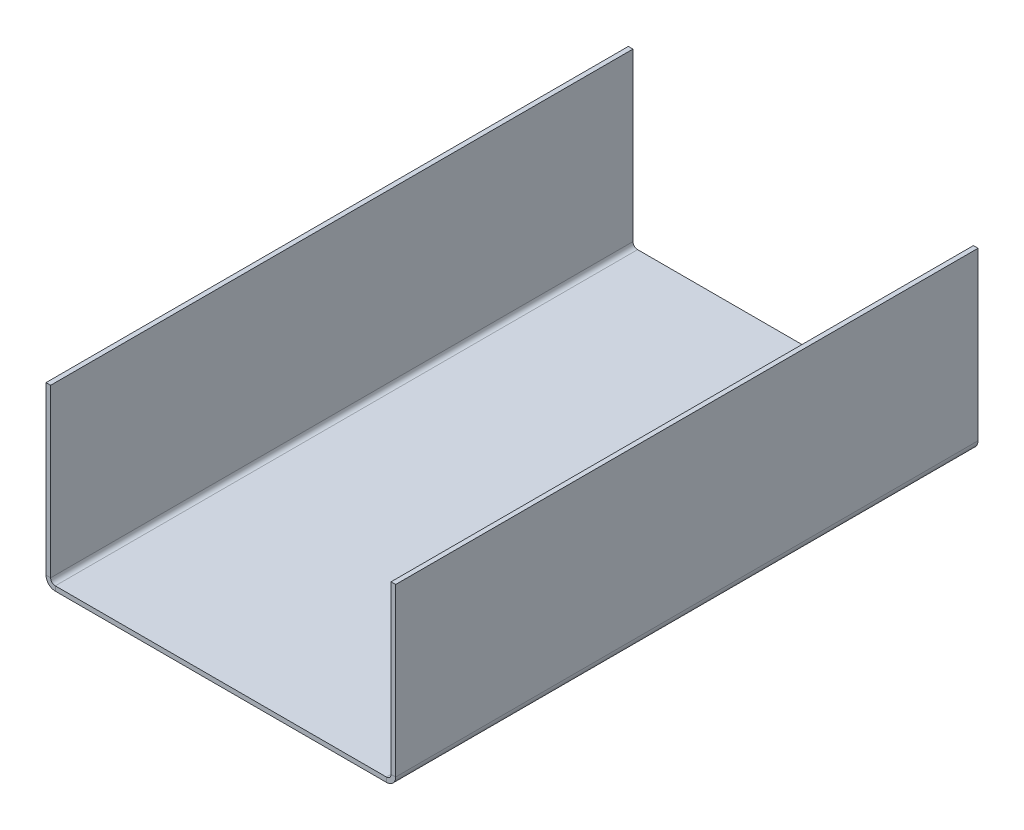
ISO-10303-21;
HEADER;
FILE_DESCRIPTION(('STEP AP214'),'2;1');
FILE_NAME('part.step','',(''),(''),'','','');
FILE_SCHEMA(('AUTOMOTIVE_DESIGN { 1 0 10303 214 1 1 1 1 }'));
ENDSEC;
DATA;
#1=APPLICATION_CONTEXT('core data for automotive mechanical design processes');
#2=APPLICATION_PROTOCOL_DEFINITION('international standard','automotive_design',2000,#1);
#3=PRODUCT_CONTEXT('',#1,'mechanical');
#4=PRODUCT('Part','Part','',(#3));
#5=PRODUCT_RELATED_PRODUCT_CATEGORY('part','',(#4));
#6=PRODUCT_DEFINITION_FORMATION('','',#4);
#7=PRODUCT_DEFINITION_CONTEXT('part definition',#1,'design');
#8=PRODUCT_DEFINITION('design','',#6,#7);
#9=PRODUCT_DEFINITION_SHAPE('','',#8);
#10=(LENGTH_UNIT() NAMED_UNIT(*) SI_UNIT(.MILLI.,.METRE.));
#11=(NAMED_UNIT(*) PLANE_ANGLE_UNIT() SI_UNIT($,.RADIAN.));
#12=(NAMED_UNIT(*) SI_UNIT($,.STERADIAN.) SOLID_ANGLE_UNIT());
#13=UNCERTAINTY_MEASURE_WITH_UNIT(LENGTH_MEASURE(1.E-05),#10,'distance_accuracy_value','');
#14=(GEOMETRIC_REPRESENTATION_CONTEXT(3) GLOBAL_UNCERTAINTY_ASSIGNED_CONTEXT((#13)) GLOBAL_UNIT_ASSIGNED_CONTEXT((#10,
#11,#12)) REPRESENTATION_CONTEXT('',''));
#15=CARTESIAN_POINT('',(0.,0.,0.));
#16=DIRECTION('',(0.,0.,1.));
#17=DIRECTION('',(1.,0.,0.));
#18=AXIS2_PLACEMENT_3D('',#15,#16,#17);
#19=CARTESIAN_POINT('',(0.,-1.,0.));
#20=DIRECTION('',(0.,-1.,0.));
#21=DIRECTION('',(0.,0.,-1.));
#22=AXIS2_PLACEMENT_3D('',#19,#20,#21);
#23=PLANE('',#22);
#24=DIRECTION('',(1.,0.,0.));
#25=VECTOR('',#24,1.);
#26=CARTESIAN_POINT('',(-36.7467986775512,-1.,62.8654766074709));
#27=LINE('',#26,#25);
#28=CARTESIAN_POINT('',(-35.7467986775511,-1.00000000000001,62.8654766074709));
#29=VERTEX_POINT('',#28);
#30=CARTESIAN_POINT('',(35.7467986775511,-1.,62.8654766074709));
#31=VERTEX_POINT('',#30);
#32=EDGE_CURVE('E11',#29,#31,#27,.T.);
#33=ORIENTED_EDGE('',*,*,#32,.F.);
#34=DIRECTION('',(0.,0.,1.));
#35=VECTOR('',#34,1.);
#36=CARTESIAN_POINT('',(-35.7467986775511,-1.00000000000001,62.8654766074709));
#37=LINE('',#36,#35);
#38=CARTESIAN_POINT('',(-35.7467986775511,-1.,-62.8654766074709));
#39=VERTEX_POINT('',#38);
#40=EDGE_CURVE('E286',#29,#39,#37,.F.);
#41=ORIENTED_EDGE('',*,*,#40,.T.);
#42=DIRECTION('',(-1.,0.,0.));
#43=VECTOR('',#42,1.);
#44=CARTESIAN_POINT('',(-36.7467986775512,-1.,-62.8654766074709));
#45=LINE('',#44,#43);
#46=CARTESIAN_POINT('',(35.7467986775511,-1.00000000000001,-62.8654766074709));
#47=VERTEX_POINT('',#46);
#48=EDGE_CURVE('E46',#47,#39,#45,.T.);
#49=ORIENTED_EDGE('',*,*,#48,.F.);
#50=DIRECTION('',(0.,0.,-1.));
#51=VECTOR('',#50,1.);
#52=CARTESIAN_POINT('',(35.7467986775511,-1.00000000000001,-62.8654766074709));
#53=LINE('',#52,#51);
#54=EDGE_CURVE('E60',#47,#31,#53,.F.);
#55=ORIENTED_EDGE('',*,*,#54,.T.);
#56=EDGE_LOOP('',(#33,#41,#49,#55));
#57=FACE_BOUND('',#56,.T.);
#58=ADVANCED_FACE('F37',(#57),#23,.T.);
#59=CARTESIAN_POINT('',(0.,0.,0.));
#60=DIRECTION('',(0.,-1.,0.));
#61=DIRECTION('',(0.,0.,-1.));
#62=AXIS2_PLACEMENT_3D('',#59,#60,#61);
#63=PLANE('',#62);
#64=DIRECTION('',(0.,0.,1.));
#65=VECTOR('',#64,1.);
#66=CARTESIAN_POINT('',(-35.7467986775511,0.,62.8654766074709));
#67=LINE('',#66,#65);
#68=CARTESIAN_POINT('',(-35.7467986775511,0.,62.8654766074709));
#69=VERTEX_POINT('',#68);
#70=CARTESIAN_POINT('',(-35.7467986775511,0.,-62.8654766074709));
#71=VERTEX_POINT('',#70);
#72=EDGE_CURVE('E158',#69,#71,#67,.F.);
#73=ORIENTED_EDGE('',*,*,#72,.F.);
#74=DIRECTION('',(1.,0.,0.));
#75=VECTOR('',#74,1.);
#76=CARTESIAN_POINT('',(-36.7467986775512,0.,62.8654766074709));
#77=LINE('',#76,#75);
#78=CARTESIAN_POINT('',(35.7467986775511,0.,62.8654766074709));
#79=VERTEX_POINT('',#78);
#80=EDGE_CURVE('E41',#69,#79,#77,.T.);
#81=ORIENTED_EDGE('',*,*,#80,.T.);
#82=DIRECTION('',(0.,0.,-1.));
#83=VECTOR('',#82,1.);
#84=CARTESIAN_POINT('',(35.7467986775511,0.,-62.8654766074709));
#85=LINE('',#84,#83);
#86=CARTESIAN_POINT('',(35.7467986775511,0.,-62.8654766074709));
#87=VERTEX_POINT('',#86);
#88=EDGE_CURVE('E104',#87,#79,#85,.F.);
#89=ORIENTED_EDGE('',*,*,#88,.F.);
#90=DIRECTION('',(-1.,0.,0.));
#91=VECTOR('',#90,1.);
#92=CARTESIAN_POINT('',(-36.7467986775512,0.,-62.8654766074709));
#93=LINE('',#92,#91);
#94=EDGE_CURVE('E146',#87,#71,#93,.T.);
#95=ORIENTED_EDGE('',*,*,#94,.T.);
#96=EDGE_LOOP('',(#73,#81,#89,#95));
#97=FACE_BOUND('',#96,.T.);
#98=ADVANCED_FACE('F155',(#97),#63,.F.);
#99=CARTESIAN_POINT('',(-36.7467986775512,-1.,62.8654766074709));
#100=DIRECTION('',(0.,0.,1.));
#101=DIRECTION('',(1.,0.,0.));
#102=AXIS2_PLACEMENT_3D('',#99,#100,#101);
#103=PLANE('',#102);
#104=ORIENTED_EDGE('',*,*,#80,.F.);
#105=DIRECTION('',(0.,-1.,0.));
#106=VECTOR('',#105,1.);
#107=CARTESIAN_POINT('',(-35.7467986775511,0.,62.8654766074709));
#108=LINE('',#107,#106);
#109=EDGE_CURVE('E292',#69,#29,#108,.T.);
#110=ORIENTED_EDGE('',*,*,#109,.T.);
#111=ORIENTED_EDGE('',*,*,#32,.T.);
#112=DIRECTION('',(0.,-1.,0.));
#113=VECTOR('',#112,1.);
#114=CARTESIAN_POINT('',(35.7467986775511,0.,62.8654766074709));
#115=LINE('',#114,#113);
#116=EDGE_CURVE('E143',#79,#31,#115,.T.);
#117=ORIENTED_EDGE('',*,*,#116,.F.);
#118=EDGE_LOOP('',(#104,#110,#111,#117));
#119=FACE_BOUND('',#118,.T.);
#120=ADVANCED_FACE('F162',(#119),#103,.T.);
#121=CARTESIAN_POINT('',(-36.7467986775512,-1.,-62.8654766074709));
#122=DIRECTION('',(0.,0.,-1.));
#123=DIRECTION('',(-1.,0.,0.));
#124=AXIS2_PLACEMENT_3D('',#121,#122,#123);
#125=PLANE('',#124);
#126=DIRECTION('',(0.,-1.,0.));
#127=VECTOR('',#126,1.);
#128=CARTESIAN_POINT('',(-35.7467986775511,0.,-62.8654766074709));
#129=LINE('',#128,#127);
#130=EDGE_CURVE('E301',#71,#39,#129,.T.);
#131=ORIENTED_EDGE('',*,*,#130,.F.);
#132=ORIENTED_EDGE('',*,*,#94,.F.);
#133=DIRECTION('',(0.,-1.,0.));
#134=VECTOR('',#133,1.);
#135=CARTESIAN_POINT('',(35.7467986775511,0.,-62.8654766074709));
#136=LINE('',#135,#134);
#137=EDGE_CURVE('E103',#87,#47,#136,.T.);
#138=ORIENTED_EDGE('',*,*,#137,.T.);
#139=ORIENTED_EDGE('',*,*,#48,.T.);
#140=EDGE_LOOP('',(#131,#132,#138,#139));
#141=FACE_BOUND('',#140,.T.);
#142=ADVANCED_FACE('F39',(#141),#125,.T.);
#143=CARTESIAN_POINT('',(35.7467986775511,0.999999999999997,62.8654766074709));
#144=DIRECTION('',(0.,0.,1.));
#145=DIRECTION('',(1.,0.,0.));
#146=AXIS2_PLACEMENT_3D('',#143,#144,#145);
#147=PLANE('',#146);
#148=DIRECTION('',(1.,0.,0.));
#149=VECTOR('',#148,1.);
#150=CARTESIAN_POINT('',(36.7467986775512,0.999999999999994,62.8654766074709));
#151=LINE('',#150,#149);
#152=CARTESIAN_POINT('',(36.7467986775512,0.999999999999994,62.8654766074709));
#153=VERTEX_POINT('',#152);
#154=CARTESIAN_POINT('',(37.7467986775512,0.99999999999999,62.8654766074709));
#155=VERTEX_POINT('',#154);
#156=EDGE_CURVE('E94',#153,#155,#151,.T.);
#157=ORIENTED_EDGE('',*,*,#156,.F.);
#158=CARTESIAN_POINT('',(35.7467986775511,0.999999999999997,62.8654766074709));
#159=DIRECTION('',(0.,0.,-1.));
#160=DIRECTION('',(-1.,0.,0.));
#161=AXIS2_PLACEMENT_3D('',#158,#159,#160);
#162=CIRCLE('',#161,1.00000000000001);
#163=EDGE_CURVE('E88',#79,#153,#162,.F.);
#164=ORIENTED_EDGE('',*,*,#163,.F.);
#165=ORIENTED_EDGE('',*,*,#116,.T.);
#166=CARTESIAN_POINT('',(35.7467986775511,0.999999999999997,62.8654766074709));
#167=DIRECTION('',(0.,0.,-1.));
#168=DIRECTION('',(-1.,0.,0.));
#169=AXIS2_PLACEMENT_3D('',#166,#167,#168);
#170=CIRCLE('',#169,2.00000000000001);
#171=EDGE_CURVE('E136',#31,#155,#170,.F.);
#172=ORIENTED_EDGE('',*,*,#171,.T.);
#173=EDGE_LOOP('',(#157,#164,#165,#172));
#174=FACE_BOUND('',#173,.T.);
#175=ADVANCED_FACE('F160',(#174),#147,.T.);
#176=CARTESIAN_POINT('',(35.7467986775511,0.999999999999997,-62.8654766074709));
#177=DIRECTION('',(0.,0.,1.));
#178=DIRECTION('',(1.,0.,0.));
#179=AXIS2_PLACEMENT_3D('',#176,#177,#178);
#180=PLANE('',#179);
#181=CARTESIAN_POINT('',(35.7467986775511,0.999999999999997,-62.8654766074709));
#182=DIRECTION('',(0.,0.,-1.));
#183=DIRECTION('',(-1.,0.,0.));
#184=AXIS2_PLACEMENT_3D('',#181,#182,#183);
#185=CIRCLE('',#184,1.00000000000001);
#186=CARTESIAN_POINT('',(36.7467986775512,0.999999999999994,-62.8654766074709));
#187=VERTEX_POINT('',#186);
#188=EDGE_CURVE('E85',#187,#87,#185,.T.);
#189=ORIENTED_EDGE('',*,*,#188,.F.);
#190=DIRECTION('',(1.,0.,0.));
#191=VECTOR('',#190,1.);
#192=CARTESIAN_POINT('',(36.7467986775512,0.999999999999994,-62.8654766074709));
#193=LINE('',#192,#191);
#194=CARTESIAN_POINT('',(37.7467986775512,0.99999999999999,-62.8654766074709));
#195=VERTEX_POINT('',#194);
#196=EDGE_CURVE('E93',#187,#195,#193,.T.);
#197=ORIENTED_EDGE('',*,*,#196,.T.);
#198=CARTESIAN_POINT('',(35.7467986775511,0.999999999999997,-62.8654766074709));
#199=DIRECTION('',(0.,0.,-1.));
#200=DIRECTION('',(-1.,0.,0.));
#201=AXIS2_PLACEMENT_3D('',#198,#199,#200);
#202=CIRCLE('',#201,2.00000000000001);
#203=EDGE_CURVE('E137',#195,#47,#202,.T.);
#204=ORIENTED_EDGE('',*,*,#203,.T.);
#205=ORIENTED_EDGE('',*,*,#137,.F.);
#206=EDGE_LOOP('',(#189,#197,#204,#205));
#207=FACE_BOUND('',#206,.T.);
#208=ADVANCED_FACE('F99',(#207),#180,.F.);
#209=CARTESIAN_POINT('',(35.7467986775511,0.999999999999997,-62.8654766074709));
#210=DIRECTION('',(0.,0.,-1.));
#211=DIRECTION('',(1.,0.,0.));
#212=AXIS2_PLACEMENT_3D('',#209,#210,#211);
#213=CYLINDRICAL_SURFACE('',#212,2.00000000000001);
#214=ORIENTED_EDGE('',*,*,#54,.F.);
#215=ORIENTED_EDGE('',*,*,#203,.F.);
#216=DIRECTION('',(0.,0.,1.));
#217=VECTOR('',#216,1.);
#218=CARTESIAN_POINT('',(37.7467986775512,0.99999999999999,0.));
#219=LINE('',#218,#217);
#220=EDGE_CURVE('E117',#195,#155,#219,.T.);
#221=ORIENTED_EDGE('',*,*,#220,.T.);
#222=ORIENTED_EDGE('',*,*,#171,.F.);
#223=EDGE_LOOP('',(#214,#215,#221,#222));
#224=FACE_BOUND('',#223,.T.);
#225=ADVANCED_FACE('F178',(#224),#213,.T.);
#226=CARTESIAN_POINT('',(35.7467986775511,0.999999999999997,-62.8654766074709));
#227=DIRECTION('',(0.,0.,-1.));
#228=DIRECTION('',(1.,0.,0.));
#229=AXIS2_PLACEMENT_3D('',#226,#227,#228);
#230=CYLINDRICAL_SURFACE('',#229,1.00000000000001);
#231=ORIENTED_EDGE('',*,*,#88,.T.);
#232=ORIENTED_EDGE('',*,*,#163,.T.);
#233=DIRECTION('',(0.,0.,-1.));
#234=VECTOR('',#233,1.);
#235=CARTESIAN_POINT('',(36.7467986775512,0.999999999999994,62.8654766074709));
#236=LINE('',#235,#234);
#237=EDGE_CURVE('E81',#153,#187,#236,.T.);
#238=ORIENTED_EDGE('',*,*,#237,.T.);
#239=ORIENTED_EDGE('',*,*,#188,.T.);
#240=EDGE_LOOP('',(#231,#232,#238,#239));
#241=FACE_BOUND('',#240,.T.);
#242=ADVANCED_FACE('F84',(#241),#230,.F.);
#243=CARTESIAN_POINT('',(37.7467986775512,0.,62.8654766074709));
#244=DIRECTION('',(0.,0.,-1.));
#245=DIRECTION('',(-1.,0.,0.));
#246=AXIS2_PLACEMENT_3D('',#243,#244,#245);
#247=PLANE('',#246);
#248=ORIENTED_EDGE('',*,*,#156,.T.);
#249=DIRECTION('',(0.,-1.,0.));
#250=VECTOR('',#249,1.);
#251=CARTESIAN_POINT('',(37.7467986775512,0.,62.8654766074709));
#252=LINE('',#251,#250);
#253=CARTESIAN_POINT('',(37.7467986775513,37.,62.8654766074709));
#254=VERTEX_POINT('',#253);
#255=EDGE_CURVE('E125',#254,#155,#252,.T.);
#256=ORIENTED_EDGE('',*,*,#255,.F.);
#257=DIRECTION('',(-1.,0.,0.));
#258=VECTOR('',#257,1.);
#259=CARTESIAN_POINT('',(37.7467986775513,37.,62.8654766074709));
#260=LINE('',#259,#258);
#261=CARTESIAN_POINT('',(36.7467986775513,37.,62.8654766074709));
#262=VERTEX_POINT('',#261);
#263=EDGE_CURVE('E130',#254,#262,#260,.T.);
#264=ORIENTED_EDGE('',*,*,#263,.T.);
#265=DIRECTION('',(0.,-1.,0.));
#266=VECTOR('',#265,1.);
#267=CARTESIAN_POINT('',(36.7467986775512,0.,62.8654766074709));
#268=LINE('',#267,#266);
#269=EDGE_CURVE('E123',#262,#153,#268,.T.);
#270=ORIENTED_EDGE('',*,*,#269,.T.);
#271=EDGE_LOOP('',(#248,#256,#264,#270));
#272=FACE_BOUND('',#271,.T.);
#273=ADVANCED_FACE('F183',(#272),#247,.F.);
#274=CARTESIAN_POINT('',(37.7467986775513,37.,-62.8654766074709));
#275=DIRECTION('',(0.,0.,1.));
#276=DIRECTION('',(1.,0.,0.));
#277=AXIS2_PLACEMENT_3D('',#274,#275,#276);
#278=PLANE('',#277);
#279=ORIENTED_EDGE('',*,*,#196,.F.);
#280=DIRECTION('',(0.,1.,0.));
#281=VECTOR('',#280,1.);
#282=CARTESIAN_POINT('',(36.7467986775513,37.,-62.8654766074709));
#283=LINE('',#282,#281);
#284=CARTESIAN_POINT('',(36.7467986775513,37.,-62.8654766074709));
#285=VERTEX_POINT('',#284);
#286=EDGE_CURVE('E113',#187,#285,#283,.T.);
#287=ORIENTED_EDGE('',*,*,#286,.T.);
#288=DIRECTION('',(-1.,0.,0.));
#289=VECTOR('',#288,1.);
#290=CARTESIAN_POINT('',(37.7467986775513,37.,-62.8654766074709));
#291=LINE('',#290,#289);
#292=CARTESIAN_POINT('',(37.7467986775513,37.,-62.8654766074709));
#293=VERTEX_POINT('',#292);
#294=EDGE_CURVE('E105',#293,#285,#291,.T.);
#295=ORIENTED_EDGE('',*,*,#294,.F.);
#296=DIRECTION('',(0.,1.,0.));
#297=VECTOR('',#296,1.);
#298=CARTESIAN_POINT('',(37.7467986775513,37.,-62.8654766074709));
#299=LINE('',#298,#297);
#300=EDGE_CURVE('E116',#195,#293,#299,.T.);
#301=ORIENTED_EDGE('',*,*,#300,.F.);
#302=EDGE_LOOP('',(#279,#287,#295,#301));
#303=FACE_BOUND('',#302,.T.);
#304=ADVANCED_FACE('F110',(#303),#278,.F.);
#305=CARTESIAN_POINT('',(37.7467986775512,-1.34428254563263E-13,0.));
#306=DIRECTION('',(-1.,0.,0.));
#307=DIRECTION('',(0.,-1.,0.));
#308=AXIS2_PLACEMENT_3D('',#305,#306,#307);
#309=PLANE('',#308);
#310=ORIENTED_EDGE('',*,*,#220,.F.);
#311=ORIENTED_EDGE('',*,*,#300,.T.);
#312=DIRECTION('',(0.,0.,1.));
#313=VECTOR('',#312,1.);
#314=CARTESIAN_POINT('',(37.7467986775513,37.,62.8654766074709));
#315=LINE('',#314,#313);
#316=EDGE_CURVE('E133',#293,#254,#315,.T.);
#317=ORIENTED_EDGE('',*,*,#316,.T.);
#318=ORIENTED_EDGE('',*,*,#255,.T.);
#319=EDGE_LOOP('',(#310,#311,#317,#318));
#320=FACE_BOUND('',#319,.T.);
#321=ADVANCED_FACE('F191',(#320),#309,.F.);
#322=CARTESIAN_POINT('',(36.7467986775512,-1.3093677322442E-13,0.));
#323=DIRECTION('',(-1.,0.,0.));
#324=DIRECTION('',(0.,-1.,0.));
#325=AXIS2_PLACEMENT_3D('',#322,#323,#324);
#326=PLANE('',#325);
#327=ORIENTED_EDGE('',*,*,#286,.F.);
#328=ORIENTED_EDGE('',*,*,#237,.F.);
#329=ORIENTED_EDGE('',*,*,#269,.F.);
#330=DIRECTION('',(0.,0.,1.));
#331=VECTOR('',#330,1.);
#332=CARTESIAN_POINT('',(36.7467986775513,37.,62.8654766074709));
#333=LINE('',#332,#331);
#334=EDGE_CURVE('E122',#285,#262,#333,.T.);
#335=ORIENTED_EDGE('',*,*,#334,.F.);
#336=EDGE_LOOP('',(#327,#328,#329,#335));
#337=FACE_BOUND('',#336,.T.);
#338=ADVANCED_FACE('F120',(#337),#326,.T.);
#339=CARTESIAN_POINT('',(37.7467986775513,37.,62.8654766074709));
#340=DIRECTION('',(0.,-1.,0.));
#341=DIRECTION('',(1.,0.,0.));
#342=AXIS2_PLACEMENT_3D('',#339,#340,#341);
#343=PLANE('',#342);
#344=ORIENTED_EDGE('',*,*,#334,.T.);
#345=ORIENTED_EDGE('',*,*,#263,.F.);
#346=ORIENTED_EDGE('',*,*,#316,.F.);
#347=ORIENTED_EDGE('',*,*,#294,.T.);
#348=EDGE_LOOP('',(#344,#345,#346,#347));
#349=FACE_BOUND('',#348,.T.);
#350=ADVANCED_FACE('F192',(#349),#343,.F.);
#351=CARTESIAN_POINT('',(-35.7467986775511,0.999999999999997,-62.8654766074709));
#352=DIRECTION('',(0.,0.,-1.));
#353=DIRECTION('',(-1.,0.,0.));
#354=AXIS2_PLACEMENT_3D('',#351,#352,#353);
#355=PLANE('',#354);
#356=DIRECTION('',(-1.,0.,0.));
#357=VECTOR('',#356,1.);
#358=CARTESIAN_POINT('',(-36.7467986775512,0.999999999999994,-62.8654766074709));
#359=LINE('',#358,#357);
#360=CARTESIAN_POINT('',(-36.7467986775512,0.999999999999994,-62.8654766074709));
#361=VERTEX_POINT('',#360);
#362=CARTESIAN_POINT('',(-37.7467986775512,0.99999999999999,-62.8654766074709));
#363=VERTEX_POINT('',#362);
#364=EDGE_CURVE('E343',#361,#363,#359,.T.);
#365=ORIENTED_EDGE('',*,*,#364,.F.);
#366=CARTESIAN_POINT('',(-35.7467986775511,0.999999999999997,-62.8654766074709));
#367=DIRECTION('',(0.,0.,1.));
#368=DIRECTION('',(1.,0.,0.));
#369=AXIS2_PLACEMENT_3D('',#366,#367,#368);
#370=CIRCLE('',#369,1.00000000000001);
#371=EDGE_CURVE('E295',#71,#361,#370,.F.);
#372=ORIENTED_EDGE('',*,*,#371,.F.);
#373=ORIENTED_EDGE('',*,*,#130,.T.);
#374=CARTESIAN_POINT('',(-35.7467986775511,0.999999999999997,-62.8654766074709));
#375=DIRECTION('',(0.,0.,1.));
#376=DIRECTION('',(1.,0.,0.));
#377=AXIS2_PLACEMENT_3D('',#374,#375,#376);
#378=CIRCLE('',#377,2.00000000000001);
#379=EDGE_CURVE('E289',#39,#363,#378,.F.);
#380=ORIENTED_EDGE('',*,*,#379,.T.);
#381=EDGE_LOOP('',(#365,#372,#373,#380));
#382=FACE_BOUND('',#381,.T.);
#383=ADVANCED_FACE('F195',(#382),#355,.T.);
#384=CARTESIAN_POINT('',(-35.7467986775511,0.999999999999997,62.8654766074709));
#385=DIRECTION('',(0.,0.,-1.));
#386=DIRECTION('',(-1.,0.,0.));
#387=AXIS2_PLACEMENT_3D('',#384,#385,#386);
#388=PLANE('',#387);
#389=CARTESIAN_POINT('',(-35.7467986775511,0.999999999999997,62.8654766074709));
#390=DIRECTION('',(0.,0.,1.));
#391=DIRECTION('',(1.,0.,0.));
#392=AXIS2_PLACEMENT_3D('',#389,#390,#391);
#393=CIRCLE('',#392,1.00000000000001);
#394=CARTESIAN_POINT('',(-36.7467986775512,0.999999999999994,62.8654766074709));
#395=VERTEX_POINT('',#394);
#396=EDGE_CURVE('E285',#395,#69,#393,.T.);
#397=ORIENTED_EDGE('',*,*,#396,.F.);
#398=DIRECTION('',(-1.,0.,0.));
#399=VECTOR('',#398,1.);
#400=CARTESIAN_POINT('',(-36.7467986775512,0.999999999999994,62.8654766074709));
#401=LINE('',#400,#399);
#402=CARTESIAN_POINT('',(-37.7467986775512,0.99999999999999,62.8654766074709));
#403=VERTEX_POINT('',#402);
#404=EDGE_CURVE('E258',#395,#403,#401,.T.);
#405=ORIENTED_EDGE('',*,*,#404,.T.);
#406=CARTESIAN_POINT('',(-35.7467986775511,0.999999999999997,62.8654766074709));
#407=DIRECTION('',(0.,0.,1.));
#408=DIRECTION('',(1.,0.,0.));
#409=AXIS2_PLACEMENT_3D('',#406,#407,#408);
#410=CIRCLE('',#409,2.00000000000001);
#411=EDGE_CURVE('E290',#403,#29,#410,.T.);
#412=ORIENTED_EDGE('',*,*,#411,.T.);
#413=ORIENTED_EDGE('',*,*,#109,.F.);
#414=EDGE_LOOP('',(#397,#405,#412,#413));
#415=FACE_BOUND('',#414,.T.);
#416=ADVANCED_FACE('F202',(#415),#388,.F.);
#417=CARTESIAN_POINT('',(-35.7467986775511,0.999999999999997,62.8654766074709));
#418=DIRECTION('',(0.,0.,1.));
#419=DIRECTION('',(-1.,0.,0.));
#420=AXIS2_PLACEMENT_3D('',#417,#418,#419);
#421=CYLINDRICAL_SURFACE('',#420,2.00000000000001);
#422=ORIENTED_EDGE('',*,*,#40,.F.);
#423=ORIENTED_EDGE('',*,*,#411,.F.);
#424=DIRECTION('',(0.,0.,-1.));
#425=VECTOR('',#424,1.);
#426=CARTESIAN_POINT('',(-37.7467986775512,0.99999999999999,0.));
#427=LINE('',#426,#425);
#428=EDGE_CURVE('E243',#403,#363,#427,.T.);
#429=ORIENTED_EDGE('',*,*,#428,.T.);
#430=ORIENTED_EDGE('',*,*,#379,.F.);
#431=EDGE_LOOP('',(#422,#423,#429,#430));
#432=FACE_BOUND('',#431,.T.);
#433=ADVANCED_FACE('F205',(#432),#421,.T.);
#434=CARTESIAN_POINT('',(-35.7467986775511,0.999999999999997,62.8654766074709));
#435=DIRECTION('',(0.,0.,1.));
#436=DIRECTION('',(-1.,0.,0.));
#437=AXIS2_PLACEMENT_3D('',#434,#435,#436);
#438=CYLINDRICAL_SURFACE('',#437,1.00000000000001);
#439=ORIENTED_EDGE('',*,*,#72,.T.);
#440=ORIENTED_EDGE('',*,*,#371,.T.);
#441=DIRECTION('',(0.,0.,1.));
#442=VECTOR('',#441,1.);
#443=CARTESIAN_POINT('',(-36.7467986775512,0.999999999999994,-62.8654766074709));
#444=LINE('',#443,#442);
#445=EDGE_CURVE('E345',#361,#395,#444,.T.);
#446=ORIENTED_EDGE('',*,*,#445,.T.);
#447=ORIENTED_EDGE('',*,*,#396,.T.);
#448=EDGE_LOOP('',(#439,#440,#446,#447));
#449=FACE_BOUND('',#448,.T.);
#450=ADVANCED_FACE('F210',(#449),#438,.F.);
#451=CARTESIAN_POINT('',(-37.7467986775512,0.,62.8654766074709));
#452=DIRECTION('',(0.,0.,1.));
#453=DIRECTION('',(1.,0.,0.));
#454=AXIS2_PLACEMENT_3D('',#451,#452,#453);
#455=PLANE('',#454);
#456=DIRECTION('',(0.,-1.,0.));
#457=VECTOR('',#456,1.);
#458=CARTESIAN_POINT('',(-37.7467986775512,0.,62.8654766074709));
#459=LINE('',#458,#457);
#460=CARTESIAN_POINT('',(-37.7467986775513,37.,62.8654766074709));
#461=VERTEX_POINT('',#460);
#462=EDGE_CURVE('E247',#461,#403,#459,.T.);
#463=ORIENTED_EDGE('',*,*,#462,.T.);
#464=ORIENTED_EDGE('',*,*,#404,.F.);
#465=DIRECTION('',(0.,-1.,0.));
#466=VECTOR('',#465,1.);
#467=CARTESIAN_POINT('',(-36.7467986775512,0.,62.8654766074709));
#468=LINE('',#467,#466);
#469=CARTESIAN_POINT('',(-36.7467986775513,37.,62.8654766074709));
#470=VERTEX_POINT('',#469);
#471=EDGE_CURVE('E257',#470,#395,#468,.T.);
#472=ORIENTED_EDGE('',*,*,#471,.F.);
#473=DIRECTION('',(1.,0.,0.));
#474=VECTOR('',#473,1.);
#475=CARTESIAN_POINT('',(-37.7467986775513,37.,62.8654766074709));
#476=LINE('',#475,#474);
#477=EDGE_CURVE('E267',#461,#470,#476,.T.);
#478=ORIENTED_EDGE('',*,*,#477,.F.);
#479=EDGE_LOOP('',(#463,#464,#472,#478));
#480=FACE_BOUND('',#479,.T.);
#481=ADVANCED_FACE('F213',(#480),#455,.T.);
#482=CARTESIAN_POINT('',(-37.7467986775513,37.,-62.8654766074709));
#483=DIRECTION('',(0.,0.,-1.));
#484=DIRECTION('',(-1.,0.,0.));
#485=AXIS2_PLACEMENT_3D('',#482,#483,#484);
#486=PLANE('',#485);
#487=DIRECTION('',(0.,1.,0.));
#488=VECTOR('',#487,1.);
#489=CARTESIAN_POINT('',(-36.7467986775513,37.,-62.8654766074709));
#490=LINE('',#489,#488);
#491=CARTESIAN_POINT('',(-36.7467986775513,37.,-62.8654766074709));
#492=VERTEX_POINT('',#491);
#493=EDGE_CURVE('E269',#361,#492,#490,.T.);
#494=ORIENTED_EDGE('',*,*,#493,.F.);
#495=ORIENTED_EDGE('',*,*,#364,.T.);
#496=DIRECTION('',(0.,1.,0.));
#497=VECTOR('',#496,1.);
#498=CARTESIAN_POINT('',(-37.7467986775513,37.,-62.8654766074709));
#499=LINE('',#498,#497);
#500=CARTESIAN_POINT('',(-37.7467986775513,37.,-62.8654766074709));
#501=VERTEX_POINT('',#500);
#502=EDGE_CURVE('E251',#363,#501,#499,.T.);
#503=ORIENTED_EDGE('',*,*,#502,.T.);
#504=DIRECTION('',(1.,0.,0.));
#505=VECTOR('',#504,1.);
#506=CARTESIAN_POINT('',(-37.7467986775513,37.,-62.8654766074709));
#507=LINE('',#506,#505);
#508=EDGE_CURVE('E278',#501,#492,#507,.T.);
#509=ORIENTED_EDGE('',*,*,#508,.T.);
#510=EDGE_LOOP('',(#494,#495,#503,#509));
#511=FACE_BOUND('',#510,.T.);
#512=ADVANCED_FACE('F220',(#511),#486,.T.);
#513=CARTESIAN_POINT('',(-37.7467986775512,-1.34428254563263E-13,0.));
#514=DIRECTION('',(1.,0.,0.));
#515=DIRECTION('',(0.,-1.,0.));
#516=AXIS2_PLACEMENT_3D('',#513,#514,#515);
#517=PLANE('',#516);
#518=ORIENTED_EDGE('',*,*,#428,.F.);
#519=ORIENTED_EDGE('',*,*,#462,.F.);
#520=DIRECTION('',(0.,0.,1.));
#521=VECTOR('',#520,1.);
#522=CARTESIAN_POINT('',(-37.7467986775513,37.,62.8654766074709));
#523=LINE('',#522,#521);
#524=EDGE_CURVE('E268',#501,#461,#523,.T.);
#525=ORIENTED_EDGE('',*,*,#524,.F.);
#526=ORIENTED_EDGE('',*,*,#502,.F.);
#527=EDGE_LOOP('',(#518,#519,#525,#526));
#528=FACE_BOUND('',#527,.T.);
#529=ADVANCED_FACE('F229',(#528),#517,.F.);
#530=CARTESIAN_POINT('',(-36.7467986775512,-1.3093677322442E-13,0.));
#531=DIRECTION('',(1.,0.,0.));
#532=DIRECTION('',(0.,-1.,0.));
#533=AXIS2_PLACEMENT_3D('',#530,#531,#532);
#534=PLANE('',#533);
#535=ORIENTED_EDGE('',*,*,#471,.T.);
#536=ORIENTED_EDGE('',*,*,#445,.F.);
#537=ORIENTED_EDGE('',*,*,#493,.T.);
#538=DIRECTION('',(0.,0.,1.));
#539=VECTOR('',#538,1.);
#540=CARTESIAN_POINT('',(-36.7467986775513,37.,62.8654766074709));
#541=LINE('',#540,#539);
#542=EDGE_CURVE('E273',#492,#470,#541,.T.);
#543=ORIENTED_EDGE('',*,*,#542,.T.);
#544=EDGE_LOOP('',(#535,#536,#537,#543));
#545=FACE_BOUND('',#544,.T.);
#546=ADVANCED_FACE('F225',(#545),#534,.T.);
#547=CARTESIAN_POINT('',(-37.7467986775513,37.,62.8654766074709));
#548=DIRECTION('',(0.,1.,0.));
#549=DIRECTION('',(-1.,0.,0.));
#550=AXIS2_PLACEMENT_3D('',#547,#548,#549);
#551=PLANE('',#550);
#552=ORIENTED_EDGE('',*,*,#542,.F.);
#553=ORIENTED_EDGE('',*,*,#508,.F.);
#554=ORIENTED_EDGE('',*,*,#524,.T.);
#555=ORIENTED_EDGE('',*,*,#477,.T.);
#556=EDGE_LOOP('',(#552,#553,#554,#555));
#557=FACE_BOUND('',#556,.T.);
#558=ADVANCED_FACE('F222',(#557),#551,.T.);
#559=CLOSED_SHELL('',(#58,#98,#120,#142,#175,#208,#225,#242,#273,#304,#321,#338,#350,#383,#416,
#433,#450,#481,#512,#529,#546,#558));
#560=MANIFOLD_SOLID_BREP('B2',#559);
#561=ADVANCED_BREP_SHAPE_REPRESENTATION('',(#18,#560),#14);
#562=SHAPE_DEFINITION_REPRESENTATION(#9,#561);
ENDSEC;
END-ISO-10303-21;
